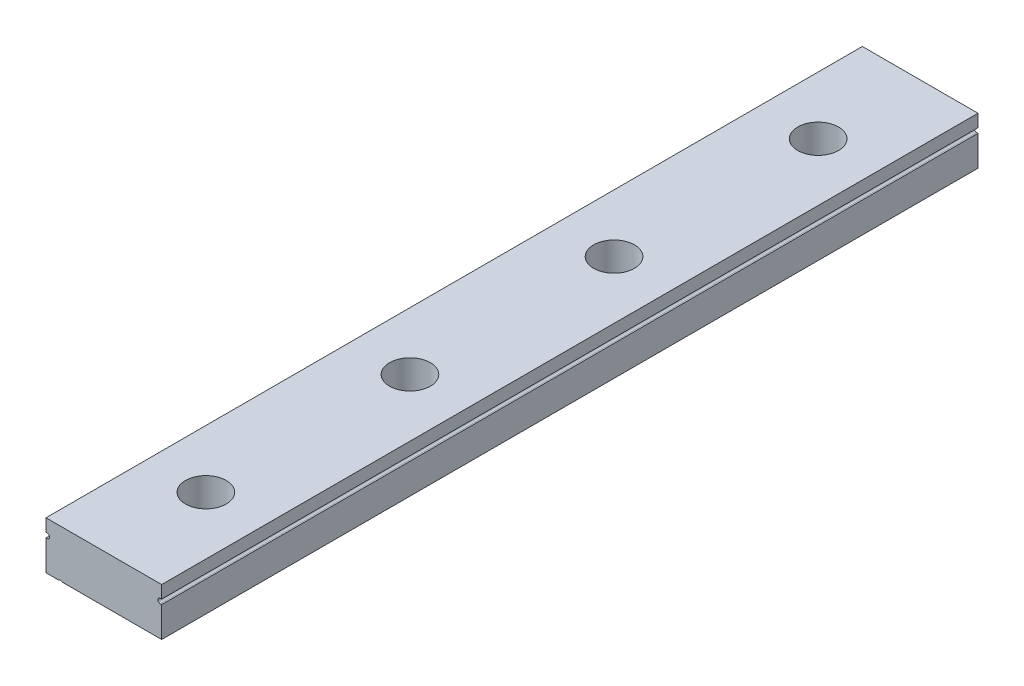
ISO-10303-21;
HEADER;
FILE_DESCRIPTION(('STEP AP214'),'2;1');
FILE_NAME('part.step','',(''),(''),'','','');
FILE_SCHEMA(('AUTOMOTIVE_DESIGN { 1 0 10303 214 1 1 1 1 }'));
ENDSEC;
DATA;
#1=APPLICATION_CONTEXT('core data for automotive mechanical design processes');
#2=APPLICATION_PROTOCOL_DEFINITION('international standard','automotive_design',2000,#1);
#3=PRODUCT_CONTEXT('',#1,'mechanical');
#4=PRODUCT('Part','Part','',(#3));
#5=PRODUCT_RELATED_PRODUCT_CATEGORY('part','',(#4));
#6=PRODUCT_DEFINITION_FORMATION('','',#4);
#7=PRODUCT_DEFINITION_CONTEXT('part definition',#1,'design');
#8=PRODUCT_DEFINITION('design','',#6,#7);
#9=PRODUCT_DEFINITION_SHAPE('','',#8);
#10=(LENGTH_UNIT() NAMED_UNIT(*) SI_UNIT(.MILLI.,.METRE.));
#11=(NAMED_UNIT(*) PLANE_ANGLE_UNIT() SI_UNIT($,.RADIAN.));
#12=(NAMED_UNIT(*) SI_UNIT($,.STERADIAN.) SOLID_ANGLE_UNIT());
#13=UNCERTAINTY_MEASURE_WITH_UNIT(LENGTH_MEASURE(1.E-05),#10,'distance_accuracy_value','');
#14=(GEOMETRIC_REPRESENTATION_CONTEXT(3) GLOBAL_UNCERTAINTY_ASSIGNED_CONTEXT((#13)) GLOBAL_UNIT_ASSIGNED_CONTEXT((#10,
#11,#12)) REPRESENTATION_CONTEXT('',''));
#15=CARTESIAN_POINT('',(0.,0.,0.));
#16=DIRECTION('',(0.,0.,1.));
#17=DIRECTION('',(1.,0.,0.));
#18=AXIS2_PLACEMENT_3D('',#15,#16,#17);
#19=CARTESIAN_POINT('',(1.75,-1.,60.7858201376173));
#20=DIRECTION('',(0.,-1.,0.));
#21=DIRECTION('',(0.,0.,-1.));
#22=AXIS2_PLACEMENT_3D('',#19,#20,#21);
#23=PLANE('',#22);
#24=CARTESIAN_POINT('',(0.,-1.,60.7858201376173));
#25=DIRECTION('',(0.,1.,0.));
#26=DIRECTION('',(0.,0.,1.));
#27=AXIS2_PLACEMENT_3D('',#24,#25,#26);
#28=CIRCLE('',#27,1.75);
#29=CARTESIAN_POINT('',(0.,-1.,62.5358201376174));
#30=VERTEX_POINT('',#29);
#31=EDGE_CURVE('E524',#30,#30,#28,.T.);
#32=ORIENTED_EDGE('',*,*,#31,.F.);
#33=EDGE_LOOP('',(#32));
#34=FACE_BOUND('',#33,.T.);
#35=CARTESIAN_POINT('',(0.,-1.,60.7858201376173));
#36=DIRECTION('',(0.,1.,0.));
#37=DIRECTION('',(0.,0.,1.));
#38=AXIS2_PLACEMENT_3D('',#35,#36,#37);
#39=CIRCLE('',#38,3.);
#40=CARTESIAN_POINT('',(0.,-1.,63.7858201376174));
#41=VERTEX_POINT('',#40);
#42=EDGE_CURVE('E328',#41,#41,#39,.T.);
#43=ORIENTED_EDGE('',*,*,#42,.T.);
#44=EDGE_LOOP('',(#43));
#45=FACE_BOUND('',#44,.T.);
#46=ADVANCED_FACE('F64',(#34,#45),#23,.F.);
#47=CARTESIAN_POINT('',(1.75,-1.,30.7858201376174));
#48=DIRECTION('',(0.,-1.,0.));
#49=DIRECTION('',(0.,0.,-1.));
#50=AXIS2_PLACEMENT_3D('',#47,#48,#49);
#51=PLANE('',#50);
#52=CARTESIAN_POINT('',(0.,-1.,30.7858201376174));
#53=DIRECTION('',(0.,1.,0.));
#54=DIRECTION('',(0.,0.,1.));
#55=AXIS2_PLACEMENT_3D('',#52,#53,#54);
#56=CIRCLE('',#55,1.75);
#57=CARTESIAN_POINT('',(0.,-1.,32.5358201376174));
#58=VERTEX_POINT('',#57);
#59=EDGE_CURVE('E331',#58,#58,#56,.T.);
#60=ORIENTED_EDGE('',*,*,#59,.F.);
#61=EDGE_LOOP('',(#60));
#62=FACE_BOUND('',#61,.T.);
#63=CARTESIAN_POINT('',(0.,-1.,30.7858201376174));
#64=DIRECTION('',(0.,1.,0.));
#65=DIRECTION('',(0.,0.,1.));
#66=AXIS2_PLACEMENT_3D('',#63,#64,#65);
#67=CIRCLE('',#66,3.);
#68=CARTESIAN_POINT('',(0.,-1.,33.7858201376174));
#69=VERTEX_POINT('',#68);
#70=EDGE_CURVE('E334',#69,#69,#67,.T.);
#71=ORIENTED_EDGE('',*,*,#70,.T.);
#72=EDGE_LOOP('',(#71));
#73=FACE_BOUND('',#72,.T.);
#74=ADVANCED_FACE('F431',(#62,#73),#51,.F.);
#75=CARTESIAN_POINT('',(1.75,-1.,0.78582013761741));
#76=DIRECTION('',(0.,-1.,0.));
#77=DIRECTION('',(0.,0.,-1.));
#78=AXIS2_PLACEMENT_3D('',#75,#76,#77);
#79=PLANE('',#78);
#80=CARTESIAN_POINT('',(0.,-1.,0.78582013761741));
#81=DIRECTION('',(0.,1.,0.));
#82=DIRECTION('',(0.,0.,1.));
#83=AXIS2_PLACEMENT_3D('',#80,#81,#82);
#84=CIRCLE('',#83,1.75);
#85=CARTESIAN_POINT('',(0.,-1.,2.53582013761741));
#86=VERTEX_POINT('',#85);
#87=EDGE_CURVE('E343',#86,#86,#84,.T.);
#88=ORIENTED_EDGE('',*,*,#87,.F.);
#89=EDGE_LOOP('',(#88));
#90=FACE_BOUND('',#89,.T.);
#91=CARTESIAN_POINT('',(0.,-1.,0.78582013761741));
#92=DIRECTION('',(0.,1.,0.));
#93=DIRECTION('',(0.,0.,1.));
#94=AXIS2_PLACEMENT_3D('',#91,#92,#93);
#95=CIRCLE('',#94,3.);
#96=CARTESIAN_POINT('',(0.,-1.,3.78582013761741));
#97=VERTEX_POINT('',#96);
#98=EDGE_CURVE('E346',#97,#97,#95,.T.);
#99=ORIENTED_EDGE('',*,*,#98,.T.);
#100=EDGE_LOOP('',(#99));
#101=FACE_BOUND('',#100,.T.);
#102=ADVANCED_FACE('F437',(#90,#101),#79,.F.);
#103=CARTESIAN_POINT('',(0.,3.5,60.7858201376173));
#104=DIRECTION('',(0.,1.,0.));
#105=DIRECTION('',(0.,0.,1.));
#106=AXIS2_PLACEMENT_3D('',#103,#104,#105);
#107=CYLINDRICAL_SURFACE('',#106,1.75);
#108=CARTESIAN_POINT('',(0.,-3.5,60.7858201376173));
#109=DIRECTION('',(0.,1.,0.));
#110=DIRECTION('',(0.,0.,1.));
#111=AXIS2_PLACEMENT_3D('',#108,#109,#110);
#112=CIRCLE('',#111,1.75);
#113=CARTESIAN_POINT('',(0.,-3.5,62.5358201376174));
#114=VERTEX_POINT('',#113);
#115=EDGE_CURVE('E313',#114,#114,#112,.T.);
#116=ORIENTED_EDGE('',*,*,#115,.F.);
#117=EDGE_LOOP('',(#116));
#118=FACE_BOUND('',#117,.T.);
#119=ORIENTED_EDGE('',*,*,#31,.T.);
#120=EDGE_LOOP('',(#119));
#121=FACE_BOUND('',#120,.T.);
#122=ADVANCED_FACE('F444',(#118,#121),#107,.F.);
#123=CARTESIAN_POINT('',(0.,3.5,30.7858201376174));
#124=DIRECTION('',(0.,1.,0.));
#125=DIRECTION('',(0.,0.,1.));
#126=AXIS2_PLACEMENT_3D('',#123,#124,#125);
#127=CYLINDRICAL_SURFACE('',#126,1.75);
#128=CARTESIAN_POINT('',(0.,-3.5,30.7858201376174));
#129=DIRECTION('',(0.,1.,0.));
#130=DIRECTION('',(0.,0.,1.));
#131=AXIS2_PLACEMENT_3D('',#128,#129,#130);
#132=CIRCLE('',#131,1.75);
#133=CARTESIAN_POINT('',(0.,-3.5,32.5358201376174));
#134=VERTEX_POINT('',#133);
#135=EDGE_CURVE('E327',#134,#134,#132,.T.);
#136=ORIENTED_EDGE('',*,*,#135,.F.);
#137=EDGE_LOOP('',(#136));
#138=FACE_BOUND('',#137,.T.);
#139=ORIENTED_EDGE('',*,*,#59,.T.);
#140=EDGE_LOOP('',(#139));
#141=FACE_BOUND('',#140,.T.);
#142=ADVANCED_FACE('F452',(#138,#141),#127,.F.);
#143=CARTESIAN_POINT('',(0.,3.5,0.78582013761741));
#144=DIRECTION('',(0.,1.,0.));
#145=DIRECTION('',(0.,0.,1.));
#146=AXIS2_PLACEMENT_3D('',#143,#144,#145);
#147=CYLINDRICAL_SURFACE('',#146,1.75);
#148=CARTESIAN_POINT('',(0.,-3.5,0.78582013761741));
#149=DIRECTION('',(0.,1.,0.));
#150=DIRECTION('',(0.,0.,1.));
#151=AXIS2_PLACEMENT_3D('',#148,#149,#150);
#152=CIRCLE('',#151,1.75);
#153=CARTESIAN_POINT('',(0.,-3.5,2.53582013761741));
#154=VERTEX_POINT('',#153);
#155=EDGE_CURVE('E340',#154,#154,#152,.T.);
#156=ORIENTED_EDGE('',*,*,#155,.F.);
#157=EDGE_LOOP('',(#156));
#158=FACE_BOUND('',#157,.T.);
#159=ORIENTED_EDGE('',*,*,#87,.T.);
#160=EDGE_LOOP('',(#159));
#161=FACE_BOUND('',#160,.T.);
#162=ADVANCED_FACE('F454',(#158,#161),#147,.F.);
#163=CARTESIAN_POINT('',(0.,3.5,-29.2141798623826));
#164=DIRECTION('',(0.,1.,0.));
#165=DIRECTION('',(0.,0.,1.));
#166=AXIS2_PLACEMENT_3D('',#163,#164,#165);
#167=CYLINDRICAL_SURFACE('',#166,1.75);
#168=CARTESIAN_POINT('',(0.,-3.5,-29.2141798623826));
#169=DIRECTION('',(0.,1.,0.));
#170=DIRECTION('',(0.,0.,1.));
#171=AXIS2_PLACEMENT_3D('',#168,#169,#170);
#172=CIRCLE('',#171,1.75);
#173=CARTESIAN_POINT('',(0.,-3.5,-27.4641798623826));
#174=VERTEX_POINT('',#173);
#175=EDGE_CURVE('E352',#174,#174,#172,.T.);
#176=ORIENTED_EDGE('',*,*,#175,.F.);
#177=EDGE_LOOP('',(#176));
#178=FACE_BOUND('',#177,.T.);
#179=CARTESIAN_POINT('',(0.,-1.,-29.2141798623826));
#180=DIRECTION('',(0.,1.,0.));
#181=DIRECTION('',(0.,0.,1.));
#182=AXIS2_PLACEMENT_3D('',#179,#180,#181);
#183=CIRCLE('',#182,1.75);
#184=CARTESIAN_POINT('',(0.,-1.,-27.4641798623826));
#185=VERTEX_POINT('',#184);
#186=EDGE_CURVE('E355',#185,#185,#183,.T.);
#187=ORIENTED_EDGE('',*,*,#186,.T.);
#188=EDGE_LOOP('',(#187));
#189=FACE_BOUND('',#188,.T.);
#190=ADVANCED_FACE('F463',(#178,#189),#167,.F.);
#191=CARTESIAN_POINT('',(-6.09999999999996,-3.5,250.));
#192=DIRECTION('',(0.,1.,0.));
#193=DIRECTION('',(-1.,0.,0.));
#194=AXIS2_PLACEMENT_3D('',#191,#192,#193);
#195=PLANE('',#194);
#196=ORIENTED_EDGE('',*,*,#175,.T.);
#197=EDGE_LOOP('',(#196));
#198=FACE_BOUND('',#197,.T.);
#199=ORIENTED_EDGE('',*,*,#155,.T.);
#200=EDGE_LOOP('',(#199));
#201=FACE_BOUND('',#200,.T.);
#202=ORIENTED_EDGE('',*,*,#135,.T.);
#203=EDGE_LOOP('',(#202));
#204=FACE_BOUND('',#203,.T.);
#205=ORIENTED_EDGE('',*,*,#115,.T.);
#206=EDGE_LOOP('',(#205));
#207=FACE_BOUND('',#206,.T.);
#208=DIRECTION('',(1.,0.,0.));
#209=VECTOR('',#208,1.);
#210=CARTESIAN_POINT('',(-6.09999999999996,-3.5,75.7858201376173));
#211=LINE('',#210,#209);
#212=CARTESIAN_POINT('',(-6.09999999999996,-3.5,75.7858201376173));
#213=VERTEX_POINT('',#212);
#214=CARTESIAN_POINT('',(8.50081999523211,-3.5,75.7858201376173));
#215=VERTEX_POINT('',#214);
#216=EDGE_CURVE('E222',#213,#215,#211,.T.);
#217=ORIENTED_EDGE('',*,*,#216,.F.);
#218=DIRECTION('',(0.,0.,-1.));
#219=VECTOR('',#218,1.);
#220=CARTESIAN_POINT('',(-6.09999999999996,-3.5,250.));
#221=LINE('',#220,#219);
#222=CARTESIAN_POINT('',(-6.09999999999996,-3.5,-44.2141798623827));
#223=VERTEX_POINT('',#222);
#224=EDGE_CURVE('E302',#213,#223,#221,.T.);
#225=ORIENTED_EDGE('',*,*,#224,.T.);
#226=DIRECTION('',(1.,0.,0.));
#227=VECTOR('',#226,1.);
#228=CARTESIAN_POINT('',(-6.09999999999996,-3.5,-44.2141798623827));
#229=LINE('',#228,#227);
#230=CARTESIAN_POINT('',(8.50081999523211,-3.5,-44.2141798623827));
#231=VERTEX_POINT('',#230);
#232=EDGE_CURVE('E201',#223,#231,#229,.T.);
#233=ORIENTED_EDGE('',*,*,#232,.T.);
#234=DIRECTION('',(0.,0.,-1.));
#235=VECTOR('',#234,1.);
#236=CARTESIAN_POINT('',(8.50081999523211,-3.5,250.));
#237=LINE('',#236,#235);
#238=EDGE_CURVE('E241',#215,#231,#237,.T.);
#239=ORIENTED_EDGE('',*,*,#238,.F.);
#240=EDGE_LOOP('',(#217,#225,#233,#239));
#241=FACE_BOUND('',#240,.T.);
#242=ADVANCED_FACE('F381',(#198,#201,#204,#207,#241),#195,.F.);
#243=CARTESIAN_POINT('',(-8.59999999999999,-3.5,250.));
#244=DIRECTION('',(0.,1.,0.));
#245=DIRECTION('',(-1.,0.,0.));
#246=AXIS2_PLACEMENT_3D('',#243,#244,#245);
#247=PLANE('',#246);
#248=DIRECTION('',(1.,0.,0.));
#249=VECTOR('',#248,1.);
#250=CARTESIAN_POINT('',(-8.59999999999999,-3.5,75.7858201376173));
#251=LINE('',#250,#249);
#252=CARTESIAN_POINT('',(-8.5008199952321,-3.5,75.7858201376173));
#253=VERTEX_POINT('',#252);
#254=CARTESIAN_POINT('',(-6.59999999999996,-3.5,75.7858201376173));
#255=VERTEX_POINT('',#254);
#256=EDGE_CURVE('E14',#253,#255,#251,.T.);
#257=ORIENTED_EDGE('',*,*,#256,.F.);
#258=DIRECTION('',(0.,0.,1.));
#259=VECTOR('',#258,1.);
#260=CARTESIAN_POINT('',(-8.5008199952321,-3.5,250.));
#261=LINE('',#260,#259);
#262=CARTESIAN_POINT('',(-8.5008199952321,-3.5,-44.2141798623827));
#263=VERTEX_POINT('',#262);
#264=EDGE_CURVE('E361',#263,#253,#261,.T.);
#265=ORIENTED_EDGE('',*,*,#264,.F.);
#266=DIRECTION('',(1.,0.,0.));
#267=VECTOR('',#266,1.);
#268=CARTESIAN_POINT('',(-8.59999999999999,-3.5,-44.2141798623827));
#269=LINE('',#268,#267);
#270=CARTESIAN_POINT('',(-6.59999999999996,-3.5,-44.2141798623827));
#271=VERTEX_POINT('',#270);
#272=EDGE_CURVE('E72',#263,#271,#269,.T.);
#273=ORIENTED_EDGE('',*,*,#272,.T.);
#274=DIRECTION('',(0.,0.,-1.));
#275=VECTOR('',#274,1.);
#276=CARTESIAN_POINT('',(-6.59999999999996,-3.5,250.));
#277=LINE('',#276,#275);
#278=EDGE_CURVE('E243',#255,#271,#277,.T.);
#279=ORIENTED_EDGE('',*,*,#278,.F.);
#280=EDGE_LOOP('',(#257,#265,#273,#279));
#281=FACE_BOUND('',#280,.T.);
#282=ADVANCED_FACE('F368',(#281),#247,.F.);
#283=CARTESIAN_POINT('',(-6.34999999999996,-3.7625,250.));
#284=DIRECTION('',(0.,0.,-1.));
#285=DIRECTION('',(-1.,0.,0.));
#286=AXIS2_PLACEMENT_3D('',#283,#284,#285);
#287=CYLINDRICAL_SURFACE('',#286,0.362500000000001);
#288=CARTESIAN_POINT('',(-6.34999999999996,-3.7625,75.7858201376173));
#289=DIRECTION('',(0.,0.,1.));
#290=DIRECTION('',(1.,0.,0.));
#291=AXIS2_PLACEMENT_3D('',#288,#289,#290);
#292=CIRCLE('',#291,0.362500000000001);
#293=EDGE_CURVE('E220',#255,#213,#292,.F.);
#294=ORIENTED_EDGE('',*,*,#293,.F.);
#295=ORIENTED_EDGE('',*,*,#278,.T.);
#296=CARTESIAN_POINT('',(-6.34999999999996,-3.7625,-44.2141798623827));
#297=DIRECTION('',(0.,0.,1.));
#298=DIRECTION('',(1.,0.,0.));
#299=AXIS2_PLACEMENT_3D('',#296,#297,#298);
#300=CIRCLE('',#299,0.362500000000001);
#301=EDGE_CURVE('E198',#271,#223,#300,.F.);
#302=ORIENTED_EDGE('',*,*,#301,.T.);
#303=ORIENTED_EDGE('',*,*,#224,.F.);
#304=EDGE_LOOP('',(#294,#295,#302,#303));
#305=FACE_BOUND('',#304,.T.);
#306=ADVANCED_FACE('F372',(#305),#287,.F.);
#307=CARTESIAN_POINT('',(1.75,-1.,-29.2141798623826));
#308=DIRECTION('',(0.,-1.,0.));
#309=DIRECTION('',(0.,0.,-1.));
#310=AXIS2_PLACEMENT_3D('',#307,#308,#309);
#311=PLANE('',#310);
#312=ORIENTED_EDGE('',*,*,#186,.F.);
#313=EDGE_LOOP('',(#312));
#314=FACE_BOUND('',#313,.T.);
#315=CARTESIAN_POINT('',(0.,-1.,-29.2141798623826));
#316=DIRECTION('',(0.,1.,0.));
#317=DIRECTION('',(0.,0.,1.));
#318=AXIS2_PLACEMENT_3D('',#315,#316,#317);
#319=CIRCLE('',#318,3.);
#320=CARTESIAN_POINT('',(0.,-1.,-26.2141798623826));
#321=VERTEX_POINT('',#320);
#322=EDGE_CURVE('E358',#321,#321,#319,.T.);
#323=ORIENTED_EDGE('',*,*,#322,.T.);
#324=EDGE_LOOP('',(#323));
#325=FACE_BOUND('',#324,.T.);
#326=ADVANCED_FACE('F450',(#314,#325),#311,.F.);
#327=CARTESIAN_POINT('',(0.,3.5,60.7858201376173));
#328=DIRECTION('',(0.,1.,0.));
#329=DIRECTION('',(0.,0.,1.));
#330=AXIS2_PLACEMENT_3D('',#327,#328,#329);
#331=CYLINDRICAL_SURFACE('',#330,3.);
#332=ORIENTED_EDGE('',*,*,#42,.F.);
#333=EDGE_LOOP('',(#332));
#334=FACE_BOUND('',#333,.T.);
#335=CARTESIAN_POINT('',(0.,3.5,60.7858201376173));
#336=DIRECTION('',(0.,1.,0.));
#337=DIRECTION('',(0.,0.,1.));
#338=AXIS2_PLACEMENT_3D('',#335,#336,#337);
#339=CIRCLE('',#338,3.);
#340=CARTESIAN_POINT('',(0.,3.5,63.7858201376174));
#341=VERTEX_POINT('',#340);
#342=EDGE_CURVE('E307',#341,#341,#339,.T.);
#343=ORIENTED_EDGE('',*,*,#342,.T.);
#344=EDGE_LOOP('',(#343));
#345=FACE_BOUND('',#344,.T.);
#346=ADVANCED_FACE('F446',(#334,#345),#331,.F.);
#347=CARTESIAN_POINT('',(0.,3.5,30.7858201376174));
#348=DIRECTION('',(0.,1.,0.));
#349=DIRECTION('',(0.,0.,1.));
#350=AXIS2_PLACEMENT_3D('',#347,#348,#349);
#351=CYLINDRICAL_SURFACE('',#350,3.);
#352=ORIENTED_EDGE('',*,*,#70,.F.);
#353=EDGE_LOOP('',(#352));
#354=FACE_BOUND('',#353,.T.);
#355=CARTESIAN_POINT('',(0.,3.5,30.7858201376174));
#356=DIRECTION('',(0.,1.,0.));
#357=DIRECTION('',(0.,0.,1.));
#358=AXIS2_PLACEMENT_3D('',#355,#356,#357);
#359=CIRCLE('',#358,3.);
#360=CARTESIAN_POINT('',(0.,3.5,33.7858201376174));
#361=VERTEX_POINT('',#360);
#362=EDGE_CURVE('E322',#361,#361,#359,.T.);
#363=ORIENTED_EDGE('',*,*,#362,.T.);
#364=EDGE_LOOP('',(#363));
#365=FACE_BOUND('',#364,.T.);
#366=ADVANCED_FACE('F449',(#354,#365),#351,.F.);
#367=CARTESIAN_POINT('',(0.,3.5,0.78582013761741));
#368=DIRECTION('',(0.,1.,0.));
#369=DIRECTION('',(0.,0.,1.));
#370=AXIS2_PLACEMENT_3D('',#367,#368,#369);
#371=CYLINDRICAL_SURFACE('',#370,3.);
#372=ORIENTED_EDGE('',*,*,#98,.F.);
#373=EDGE_LOOP('',(#372));
#374=FACE_BOUND('',#373,.T.);
#375=CARTESIAN_POINT('',(0.,3.5,0.78582013761741));
#376=DIRECTION('',(0.,1.,0.));
#377=DIRECTION('',(0.,0.,1.));
#378=AXIS2_PLACEMENT_3D('',#375,#376,#377);
#379=CIRCLE('',#378,3.);
#380=CARTESIAN_POINT('',(0.,3.5,3.78582013761741));
#381=VERTEX_POINT('',#380);
#382=EDGE_CURVE('E336',#381,#381,#379,.T.);
#383=ORIENTED_EDGE('',*,*,#382,.T.);
#384=EDGE_LOOP('',(#383));
#385=FACE_BOUND('',#384,.T.);
#386=ADVANCED_FACE('F459',(#374,#385),#371,.F.);
#387=CARTESIAN_POINT('',(0.,3.5,-29.2141798623826));
#388=DIRECTION('',(0.,1.,0.));
#389=DIRECTION('',(0.,0.,1.));
#390=AXIS2_PLACEMENT_3D('',#387,#388,#389);
#391=CYLINDRICAL_SURFACE('',#390,3.);
#392=ORIENTED_EDGE('',*,*,#322,.F.);
#393=EDGE_LOOP('',(#392));
#394=FACE_BOUND('',#393,.T.);
#395=CARTESIAN_POINT('',(0.,3.5,-29.2141798623826));
#396=DIRECTION('',(0.,1.,0.));
#397=DIRECTION('',(0.,0.,1.));
#398=AXIS2_PLACEMENT_3D('',#395,#396,#397);
#399=CIRCLE('',#398,3.);
#400=CARTESIAN_POINT('',(0.,3.5,-26.2141798623827));
#401=VERTEX_POINT('',#400);
#402=EDGE_CURVE('E348',#401,#401,#399,.T.);
#403=ORIENTED_EDGE('',*,*,#402,.T.);
#404=EDGE_LOOP('',(#403));
#405=FACE_BOUND('',#404,.T.);
#406=ADVANCED_FACE('F66',(#394,#405),#391,.F.);
#407=CARTESIAN_POINT('',(8.50081999523211,3.5,250.));
#408=DIRECTION('',(0.,-1.,0.));
#409=DIRECTION('',(1.,0.,0.));
#410=AXIS2_PLACEMENT_3D('',#407,#408,#409);
#411=PLANE('',#410);
#412=ORIENTED_EDGE('',*,*,#402,.F.);
#413=EDGE_LOOP('',(#412));
#414=FACE_BOUND('',#413,.T.);
#415=ORIENTED_EDGE('',*,*,#382,.F.);
#416=EDGE_LOOP('',(#415));
#417=FACE_BOUND('',#416,.T.);
#418=ORIENTED_EDGE('',*,*,#362,.F.);
#419=EDGE_LOOP('',(#418));
#420=FACE_BOUND('',#419,.T.);
#421=ORIENTED_EDGE('',*,*,#342,.F.);
#422=EDGE_LOOP('',(#421));
#423=FACE_BOUND('',#422,.T.);
#424=DIRECTION('',(1.,0.,0.));
#425=VECTOR('',#424,1.);
#426=CARTESIAN_POINT('',(0.,3.5,75.7858201376173));
#427=LINE('',#426,#425);
#428=CARTESIAN_POINT('',(-8.50081999523211,3.5,75.7858201376173));
#429=VERTEX_POINT('',#428);
#430=CARTESIAN_POINT('',(8.50081999523211,3.5,75.7858201376173));
#431=VERTEX_POINT('',#430);
#432=EDGE_CURVE('E86',#429,#431,#427,.T.);
#433=ORIENTED_EDGE('',*,*,#432,.T.);
#434=DIRECTION('',(0.,0.,-1.));
#435=VECTOR('',#434,1.);
#436=CARTESIAN_POINT('',(8.50081999523211,3.5,0.));
#437=LINE('',#436,#435);
#438=CARTESIAN_POINT('',(8.50081999523211,3.5,-44.2141798623827));
#439=VERTEX_POINT('',#438);
#440=EDGE_CURVE('E187',#431,#439,#437,.T.);
#441=ORIENTED_EDGE('',*,*,#440,.T.);
#442=DIRECTION('',(1.,0.,0.));
#443=VECTOR('',#442,1.);
#444=CARTESIAN_POINT('',(0.,3.5,-44.2141798623827));
#445=LINE('',#444,#443);
#446=CARTESIAN_POINT('',(-8.50081999523211,3.5,-44.2141798623827));
#447=VERTEX_POINT('',#446);
#448=EDGE_CURVE('E171',#447,#439,#445,.T.);
#449=ORIENTED_EDGE('',*,*,#448,.F.);
#450=DIRECTION('',(0.,0.,1.));
#451=VECTOR('',#450,1.);
#452=CARTESIAN_POINT('',(-8.50081999523211,3.5,0.));
#453=LINE('',#452,#451);
#454=EDGE_CURVE('E178',#447,#429,#453,.T.);
#455=ORIENTED_EDGE('',*,*,#454,.T.);
#456=EDGE_LOOP('',(#433,#441,#449,#455));
#457=FACE_BOUND('',#456,.T.);
#458=ADVANCED_FACE('F186',(#414,#417,#420,#423,#457),#411,.F.);
#459=CARTESIAN_POINT('',(8.50081999523211,-6.5,0.));
#460=DIRECTION('',(1.,0.,0.));
#461=DIRECTION('',(0.,1.,0.));
#462=AXIS2_PLACEMENT_3D('',#459,#460,#461);
#463=PLANE('',#462);
#464=ORIENTED_EDGE('',*,*,#238,.T.);
#465=DIRECTION('',(0.,1.,0.));
#466=VECTOR('',#465,1.);
#467=CARTESIAN_POINT('',(8.50081999523211,-6.5,-44.2141798623827));
#468=LINE('',#467,#466);
#469=CARTESIAN_POINT('',(8.50081999523211,0.950819995232105,-44.2141798623827));
#470=VERTEX_POINT('',#469);
#471=EDGE_CURVE('E184',#231,#470,#468,.T.);
#472=ORIENTED_EDGE('',*,*,#471,.T.);
#473=DIRECTION('',(0.,0.,1.));
#474=VECTOR('',#473,1.);
#475=CARTESIAN_POINT('',(8.50081999523211,0.950819995232104,250.));
#476=LINE('',#475,#474);
#477=CARTESIAN_POINT('',(8.50081999523211,0.950819995232104,75.7858201376173));
#478=VERTEX_POINT('',#477);
#479=EDGE_CURVE('E239',#470,#478,#476,.T.);
#480=ORIENTED_EDGE('',*,*,#479,.T.);
#481=DIRECTION('',(0.,1.,0.));
#482=VECTOR('',#481,1.);
#483=CARTESIAN_POINT('',(8.50081999523211,-6.5,75.7858201376173));
#484=LINE('',#483,#482);
#485=EDGE_CURVE('E386',#215,#478,#484,.T.);
#486=ORIENTED_EDGE('',*,*,#485,.F.);
#487=EDGE_LOOP('',(#464,#472,#480,#486));
#488=FACE_BOUND('',#487,.T.);
#489=ADVANCED_FACE('F384',(#488),#463,.T.);
#490=DIRECTION('',(0.,0.,-1.));
#491=VECTOR('',#490,1.);
#492=CARTESIAN_POINT('',(8.50081999523211,1.65081999523211,250.));
#493=LINE('',#492,#491);
#494=CARTESIAN_POINT('',(8.50081999523211,1.65081999523211,75.7858201376173));
#495=VERTEX_POINT('',#494);
#496=CARTESIAN_POINT('',(8.50081999523211,1.65081999523211,-44.2141798623827));
#497=VERTEX_POINT('',#496);
#498=EDGE_CURVE('E237',#495,#497,#493,.T.);
#499=ORIENTED_EDGE('',*,*,#498,.T.);
#500=EDGE_CURVE('E387',#497,#439,#468,.T.);
#501=ORIENTED_EDGE('',*,*,#500,.T.);
#502=ORIENTED_EDGE('',*,*,#440,.F.);
#503=EDGE_CURVE('E79',#495,#431,#484,.T.);
#504=ORIENTED_EDGE('',*,*,#503,.F.);
#505=EDGE_LOOP('',(#499,#501,#502,#504));
#506=FACE_BOUND('',#505,.T.);
#507=ADVANCED_FACE('F421',(#506),#463,.T.);
#508=CARTESIAN_POINT('',(0.,-6.5,75.7858201376173));
#509=DIRECTION('',(0.,0.,1.));
#510=DIRECTION('',(1.,0.,0.));
#511=AXIS2_PLACEMENT_3D('',#508,#509,#510);
#512=PLANE('',#511);
#513=DIRECTION('',(-1.,0.,0.));
#514=VECTOR('',#513,1.);
#515=CARTESIAN_POINT('',(8.50081999523211,0.950819995232104,75.7858201376173));
#516=LINE('',#515,#514);
#517=CARTESIAN_POINT('',(8.3,0.950819995232105,75.7858201376173));
#518=VERTEX_POINT('',#517);
#519=EDGE_CURVE('E235',#478,#518,#516,.T.);
#520=ORIENTED_EDGE('',*,*,#519,.T.);
#521=CARTESIAN_POINT('',(8.3,1.3008199952321,75.7858201376173));
#522=DIRECTION('',(0.,0.,1.));
#523=DIRECTION('',(1.,0.,0.));
#524=AXIS2_PLACEMENT_3D('',#521,#522,#523);
#525=CIRCLE('',#524,0.35);
#526=CARTESIAN_POINT('',(8.3,1.65081999523211,75.7858201376173));
#527=VERTEX_POINT('',#526);
#528=EDGE_CURVE('E233',#518,#527,#525,.F.);
#529=ORIENTED_EDGE('',*,*,#528,.T.);
#530=DIRECTION('',(1.,0.,0.));
#531=VECTOR('',#530,1.);
#532=CARTESIAN_POINT('',(8.3,1.65081999523211,75.7858201376173));
#533=LINE('',#532,#531);
#534=EDGE_CURVE('E231',#527,#495,#533,.T.);
#535=ORIENTED_EDGE('',*,*,#534,.T.);
#536=ORIENTED_EDGE('',*,*,#503,.T.);
#537=ORIENTED_EDGE('',*,*,#432,.F.);
#538=DIRECTION('',(0.,1.,0.));
#539=VECTOR('',#538,1.);
#540=CARTESIAN_POINT('',(-8.5008199952321,-6.5,75.7858201376173));
#541=LINE('',#540,#539);
#542=CARTESIAN_POINT('',(-8.5008199952321,1.6508199952321,75.7858201376173));
#543=VERTEX_POINT('',#542);
#544=EDGE_CURVE('E182',#543,#429,#541,.T.);
#545=ORIENTED_EDGE('',*,*,#544,.F.);
#546=DIRECTION('',(1.,0.,0.));
#547=VECTOR('',#546,1.);
#548=CARTESIAN_POINT('',(-8.50081999523211,1.6508199952321,75.7858201376173));
#549=LINE('',#548,#547);
#550=CARTESIAN_POINT('',(-8.3,1.6508199952321,75.7858201376173));
#551=VERTEX_POINT('',#550);
#552=EDGE_CURVE('E229',#543,#551,#549,.T.);
#553=ORIENTED_EDGE('',*,*,#552,.T.);
#554=CARTESIAN_POINT('',(-8.3,1.3008199952321,75.7858201376173));
#555=DIRECTION('',(0.,0.,1.));
#556=DIRECTION('',(1.,0.,0.));
#557=AXIS2_PLACEMENT_3D('',#554,#555,#556);
#558=CIRCLE('',#557,0.35);
#559=CARTESIAN_POINT('',(-8.3,0.950819995232103,75.7858201376173));
#560=VERTEX_POINT('',#559);
#561=EDGE_CURVE('E227',#551,#560,#558,.F.);
#562=ORIENTED_EDGE('',*,*,#561,.T.);
#563=DIRECTION('',(-1.,0.,0.));
#564=VECTOR('',#563,1.);
#565=CARTESIAN_POINT('',(-8.3,0.950819995232103,75.7858201376173));
#566=LINE('',#565,#564);
#567=CARTESIAN_POINT('',(-8.50081999523211,0.950819995232103,75.7858201376173));
#568=VERTEX_POINT('',#567);
#569=EDGE_CURVE('E224',#560,#568,#566,.T.);
#570=ORIENTED_EDGE('',*,*,#569,.T.);
#571=EDGE_CURVE('E192',#253,#568,#541,.T.);
#572=ORIENTED_EDGE('',*,*,#571,.F.);
#573=ORIENTED_EDGE('',*,*,#256,.T.);
#574=ORIENTED_EDGE('',*,*,#293,.T.);
#575=ORIENTED_EDGE('',*,*,#216,.T.);
#576=ORIENTED_EDGE('',*,*,#485,.T.);
#577=EDGE_LOOP('',(#520,#529,#535,#536,#537,#545,#553,#562,#570,#572,#573,#574,#575,#576));
#578=FACE_BOUND('',#577,.T.);
#579=ADVANCED_FACE('F375',(#578),#512,.T.);
#580=CARTESIAN_POINT('',(0.,-6.5,-44.2141798623827));
#581=DIRECTION('',(0.,0.,1.));
#582=DIRECTION('',(1.,0.,0.));
#583=AXIS2_PLACEMENT_3D('',#580,#581,#582);
#584=PLANE('',#583);
#585=ORIENTED_EDGE('',*,*,#471,.F.);
#586=ORIENTED_EDGE('',*,*,#232,.F.);
#587=ORIENTED_EDGE('',*,*,#301,.F.);
#588=ORIENTED_EDGE('',*,*,#272,.F.);
#589=DIRECTION('',(0.,1.,0.));
#590=VECTOR('',#589,1.);
#591=CARTESIAN_POINT('',(-8.5008199952321,-6.5,-44.2141798623827));
#592=LINE('',#591,#590);
#593=CARTESIAN_POINT('',(-8.5008199952321,0.950819995232103,-44.2141798623827));
#594=VERTEX_POINT('',#593);
#595=EDGE_CURVE('E177',#263,#594,#592,.T.);
#596=ORIENTED_EDGE('',*,*,#595,.T.);
#597=DIRECTION('',(-1.,0.,0.));
#598=VECTOR('',#597,1.);
#599=CARTESIAN_POINT('',(-8.3,0.950819995232103,-44.2141798623827));
#600=LINE('',#599,#598);
#601=CARTESIAN_POINT('',(-8.3,0.950819995232103,-44.2141798623827));
#602=VERTEX_POINT('',#601);
#603=EDGE_CURVE('E204',#602,#594,#600,.T.);
#604=ORIENTED_EDGE('',*,*,#603,.F.);
#605=CARTESIAN_POINT('',(-8.3,1.3008199952321,-44.2141798623827));
#606=DIRECTION('',(0.,0.,1.));
#607=DIRECTION('',(1.,0.,0.));
#608=AXIS2_PLACEMENT_3D('',#605,#606,#607);
#609=CIRCLE('',#608,0.35);
#610=CARTESIAN_POINT('',(-8.3,1.6508199952321,-44.2141798623827));
#611=VERTEX_POINT('',#610);
#612=EDGE_CURVE('E207',#611,#602,#609,.F.);
#613=ORIENTED_EDGE('',*,*,#612,.F.);
#614=DIRECTION('',(1.,0.,0.));
#615=VECTOR('',#614,1.);
#616=CARTESIAN_POINT('',(-8.50081999523211,1.6508199952321,-44.2141798623827));
#617=LINE('',#616,#615);
#618=CARTESIAN_POINT('',(-8.5008199952321,1.6508199952321,-44.2141798623827));
#619=VERTEX_POINT('',#618);
#620=EDGE_CURVE('E174',#619,#611,#617,.T.);
#621=ORIENTED_EDGE('',*,*,#620,.F.);
#622=EDGE_CURVE('E165',#619,#447,#592,.T.);
#623=ORIENTED_EDGE('',*,*,#622,.T.);
#624=ORIENTED_EDGE('',*,*,#448,.T.);
#625=ORIENTED_EDGE('',*,*,#500,.F.);
#626=DIRECTION('',(1.,0.,0.));
#627=VECTOR('',#626,1.);
#628=CARTESIAN_POINT('',(8.3,1.65081999523211,-44.2141798623827));
#629=LINE('',#628,#627);
#630=CARTESIAN_POINT('',(8.3,1.65081999523211,-44.2141798623827));
#631=VERTEX_POINT('',#630);
#632=EDGE_CURVE('E211',#631,#497,#629,.T.);
#633=ORIENTED_EDGE('',*,*,#632,.F.);
#634=CARTESIAN_POINT('',(8.3,1.3008199952321,-44.2141798623827));
#635=DIRECTION('',(0.,0.,1.));
#636=DIRECTION('',(1.,0.,0.));
#637=AXIS2_PLACEMENT_3D('',#634,#635,#636);
#638=CIRCLE('',#637,0.35);
#639=CARTESIAN_POINT('',(8.3,0.950819995232105,-44.2141798623827));
#640=VERTEX_POINT('',#639);
#641=EDGE_CURVE('E214',#640,#631,#638,.F.);
#642=ORIENTED_EDGE('',*,*,#641,.F.);
#643=DIRECTION('',(-1.,0.,0.));
#644=VECTOR('',#643,1.);
#645=CARTESIAN_POINT('',(8.50081999523211,0.950819995232104,-44.2141798623827));
#646=LINE('',#645,#644);
#647=EDGE_CURVE('E217',#470,#640,#646,.T.);
#648=ORIENTED_EDGE('',*,*,#647,.F.);
#649=EDGE_LOOP('',(#585,#586,#587,#588,#596,#604,#613,#621,#623,#624,#625,#633,#642,#648));
#650=FACE_BOUND('',#649,.T.);
#651=ADVANCED_FACE('F168',(#650),#584,.F.);
#652=CARTESIAN_POINT('',(-8.5008199952321,-6.5,0.));
#653=DIRECTION('',(-1.,0.,0.));
#654=DIRECTION('',(0.,-1.,0.));
#655=AXIS2_PLACEMENT_3D('',#652,#653,#654);
#656=PLANE('',#655);
#657=DIRECTION('',(0.,0.,1.));
#658=VECTOR('',#657,1.);
#659=CARTESIAN_POINT('',(-8.50081999523211,1.6508199952321,250.));
#660=LINE('',#659,#658);
#661=EDGE_CURVE('E196',#619,#543,#660,.T.);
#662=ORIENTED_EDGE('',*,*,#661,.T.);
#663=ORIENTED_EDGE('',*,*,#544,.T.);
#664=ORIENTED_EDGE('',*,*,#454,.F.);
#665=ORIENTED_EDGE('',*,*,#622,.F.);
#666=EDGE_LOOP('',(#662,#663,#664,#665));
#667=FACE_BOUND('',#666,.T.);
#668=ADVANCED_FACE('F181',(#667),#656,.T.);
#669=DIRECTION('',(0.,0.,-1.));
#670=VECTOR('',#669,1.);
#671=CARTESIAN_POINT('',(-8.50081999523211,0.950819995232103,250.));
#672=LINE('',#671,#670);
#673=EDGE_CURVE('E194',#568,#594,#672,.T.);
#674=ORIENTED_EDGE('',*,*,#673,.T.);
#675=ORIENTED_EDGE('',*,*,#595,.F.);
#676=ORIENTED_EDGE('',*,*,#264,.T.);
#677=ORIENTED_EDGE('',*,*,#571,.T.);
#678=EDGE_LOOP('',(#674,#675,#676,#677));
#679=FACE_BOUND('',#678,.T.);
#680=ADVANCED_FACE('F391',(#679),#656,.T.);
#681=CARTESIAN_POINT('',(-8.3,0.950819995232103,250.));
#682=DIRECTION('',(0.,-1.,0.));
#683=DIRECTION('',(0.,0.,-1.));
#684=AXIS2_PLACEMENT_3D('',#681,#682,#683);
#685=PLANE('',#684);
#686=ORIENTED_EDGE('',*,*,#569,.F.);
#687=DIRECTION('',(0.,0.,-1.));
#688=VECTOR('',#687,1.);
#689=CARTESIAN_POINT('',(-8.3,0.950819995232103,250.));
#690=LINE('',#689,#688);
#691=EDGE_CURVE('E247',#560,#602,#690,.T.);
#692=ORIENTED_EDGE('',*,*,#691,.T.);
#693=ORIENTED_EDGE('',*,*,#603,.T.);
#694=ORIENTED_EDGE('',*,*,#673,.F.);
#695=EDGE_LOOP('',(#686,#692,#693,#694));
#696=FACE_BOUND('',#695,.T.);
#697=ADVANCED_FACE('F398',(#696),#685,.F.);
#698=CARTESIAN_POINT('',(-8.3,1.3008199952321,250.));
#699=DIRECTION('',(0.,0.,-1.));
#700=DIRECTION('',(-1.,0.,0.));
#701=AXIS2_PLACEMENT_3D('',#698,#699,#700);
#702=CYLINDRICAL_SURFACE('',#701,0.35);
#703=ORIENTED_EDGE('',*,*,#561,.F.);
#704=DIRECTION('',(0.,0.,-1.));
#705=VECTOR('',#704,1.);
#706=CARTESIAN_POINT('',(-8.3,1.6508199952321,250.));
#707=LINE('',#706,#705);
#708=EDGE_CURVE('E403',#551,#611,#707,.T.);
#709=ORIENTED_EDGE('',*,*,#708,.T.);
#710=ORIENTED_EDGE('',*,*,#612,.T.);
#711=ORIENTED_EDGE('',*,*,#691,.F.);
#712=EDGE_LOOP('',(#703,#709,#710,#711));
#713=FACE_BOUND('',#712,.T.);
#714=ADVANCED_FACE('F401',(#713),#702,.F.);
#715=CARTESIAN_POINT('',(-8.50081999523211,1.6508199952321,250.));
#716=DIRECTION('',(0.,1.,0.));
#717=DIRECTION('',(0.,0.,1.));
#718=AXIS2_PLACEMENT_3D('',#715,#716,#717);
#719=PLANE('',#718);
#720=ORIENTED_EDGE('',*,*,#552,.F.);
#721=ORIENTED_EDGE('',*,*,#661,.F.);
#722=ORIENTED_EDGE('',*,*,#620,.T.);
#723=ORIENTED_EDGE('',*,*,#708,.F.);
#724=EDGE_LOOP('',(#720,#721,#722,#723));
#725=FACE_BOUND('',#724,.T.);
#726=ADVANCED_FACE('F501',(#725),#719,.F.);
#727=CARTESIAN_POINT('',(8.50081999523211,0.950819995232104,250.));
#728=DIRECTION('',(0.,-1.,0.));
#729=DIRECTION('',(1.,0.,0.));
#730=AXIS2_PLACEMENT_3D('',#727,#728,#729);
#731=PLANE('',#730);
#732=ORIENTED_EDGE('',*,*,#519,.F.);
#733=ORIENTED_EDGE('',*,*,#479,.F.);
#734=ORIENTED_EDGE('',*,*,#647,.T.);
#735=DIRECTION('',(0.,0.,-1.));
#736=VECTOR('',#735,1.);
#737=CARTESIAN_POINT('',(8.3,0.950819995232106,250.));
#738=LINE('',#737,#736);
#739=EDGE_CURVE('E308',#518,#640,#738,.T.);
#740=ORIENTED_EDGE('',*,*,#739,.F.);
#741=EDGE_LOOP('',(#732,#733,#734,#740));
#742=FACE_BOUND('',#741,.T.);
#743=ADVANCED_FACE('F418',(#742),#731,.F.);
#744=CARTESIAN_POINT('',(8.3,1.3008199952321,250.));
#745=DIRECTION('',(0.,0.,-1.));
#746=DIRECTION('',(-1.,0.,0.));
#747=AXIS2_PLACEMENT_3D('',#744,#745,#746);
#748=CYLINDRICAL_SURFACE('',#747,0.35);
#749=ORIENTED_EDGE('',*,*,#528,.F.);
#750=ORIENTED_EDGE('',*,*,#739,.T.);
#751=ORIENTED_EDGE('',*,*,#641,.T.);
#752=DIRECTION('',(0.,0.,-1.));
#753=VECTOR('',#752,1.);
#754=CARTESIAN_POINT('',(8.3,1.6508199952321,250.));
#755=LINE('',#754,#753);
#756=EDGE_CURVE('E406',#527,#631,#755,.T.);
#757=ORIENTED_EDGE('',*,*,#756,.F.);
#758=EDGE_LOOP('',(#749,#750,#751,#757));
#759=FACE_BOUND('',#758,.T.);
#760=ADVANCED_FACE('F415',(#759),#748,.F.);
#761=CARTESIAN_POINT('',(8.3,1.65081999523211,250.));
#762=DIRECTION('',(0.,1.,0.));
#763=DIRECTION('',(-1.,0.,0.));
#764=AXIS2_PLACEMENT_3D('',#761,#762,#763);
#765=PLANE('',#764);
#766=ORIENTED_EDGE('',*,*,#534,.F.);
#767=ORIENTED_EDGE('',*,*,#756,.T.);
#768=ORIENTED_EDGE('',*,*,#632,.T.);
#769=ORIENTED_EDGE('',*,*,#498,.F.);
#770=EDGE_LOOP('',(#766,#767,#768,#769));
#771=FACE_BOUND('',#770,.T.);
#772=ADVANCED_FACE('F420',(#771),#765,.F.);
#773=CLOSED_SHELL('',(#46,#74,#102,#122,#142,#162,#190,#242,#282,#306,#326,#346,#366,#386,#406,
#458,#489,#507,#579,#651,#668,#680,#697,#714,#726,#743,#760,#772));
#774=MANIFOLD_SOLID_BREP('B2',#773);
#775=ADVANCED_BREP_SHAPE_REPRESENTATION('',(#18,#774),#14);
#776=SHAPE_DEFINITION_REPRESENTATION(#9,#775);
ENDSEC;
END-ISO-10303-21;
